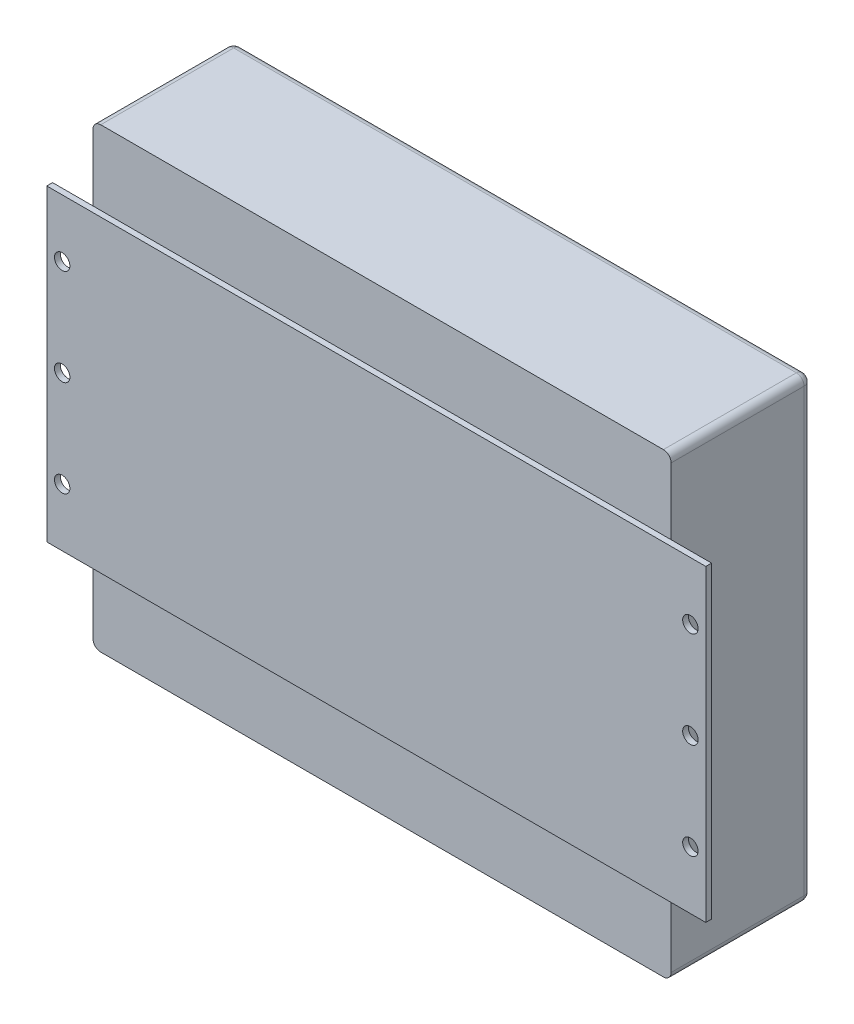
ISO-10303-21;
HEADER;
FILE_DESCRIPTION(('STEP AP214'),'2;1');
FILE_NAME('part.step','',(''),(''),'','','');
FILE_SCHEMA(('AUTOMOTIVE_DESIGN { 1 0 10303 214 1 1 1 1 }'));
ENDSEC;
DATA;
#1=APPLICATION_CONTEXT('core data for automotive mechanical design processes');
#2=APPLICATION_PROTOCOL_DEFINITION('international standard','automotive_design',2000,#1);
#3=PRODUCT_CONTEXT('',#1,'mechanical');
#4=PRODUCT('Part','Part','',(#3));
#5=PRODUCT_RELATED_PRODUCT_CATEGORY('part','',(#4));
#6=PRODUCT_DEFINITION_FORMATION('','',#4);
#7=PRODUCT_DEFINITION_CONTEXT('part definition',#1,'design');
#8=PRODUCT_DEFINITION('design','',#6,#7);
#9=PRODUCT_DEFINITION_SHAPE('','',#8);
#10=(LENGTH_UNIT() NAMED_UNIT(*) SI_UNIT(.MILLI.,.METRE.));
#11=(NAMED_UNIT(*) PLANE_ANGLE_UNIT() SI_UNIT($,.RADIAN.));
#12=(NAMED_UNIT(*) SI_UNIT($,.STERADIAN.) SOLID_ANGLE_UNIT());
#13=UNCERTAINTY_MEASURE_WITH_UNIT(LENGTH_MEASURE(1.E-05),#10,'distance_accuracy_value','');
#14=(GEOMETRIC_REPRESENTATION_CONTEXT(3) GLOBAL_UNCERTAINTY_ASSIGNED_CONTEXT((#13)) GLOBAL_UNIT_ASSIGNED_CONTEXT((#10,
#11,#12)) REPRESENTATION_CONTEXT('',''));
#15=CARTESIAN_POINT('',(0.,0.,0.));
#16=DIRECTION('',(0.,0.,1.));
#17=DIRECTION('',(1.,0.,0.));
#18=AXIS2_PLACEMENT_3D('',#15,#16,#17);
#19=CARTESIAN_POINT('',(0.,0.,0.));
#20=DIRECTION('',(0.,0.,1.));
#21=DIRECTION('',(1.,0.,0.));
#22=AXIS2_PLACEMENT_3D('',#19,#20,#21);
#23=PLANE('',#22);
#24=CARTESIAN_POINT('',(-81.5,-25.,0.));
#25=DIRECTION('',(0.,0.,1.));
#26=DIRECTION('',(1.,0.,0.));
#27=AXIS2_PLACEMENT_3D('',#24,#25,#26);
#28=CIRCLE('',#27,2.);
#29=CARTESIAN_POINT('',(-79.5,-25.,0.));
#30=VERTEX_POINT('',#29);
#31=EDGE_CURVE('E232',#30,#30,#28,.T.);
#32=ORIENTED_EDGE('',*,*,#31,.T.);
#33=EDGE_LOOP('',(#32));
#34=FACE_BOUND('',#33,.T.);
#35=CARTESIAN_POINT('',(-81.5,0.,0.));
#36=DIRECTION('',(0.,0.,1.));
#37=DIRECTION('',(1.,0.,0.));
#38=AXIS2_PLACEMENT_3D('',#35,#36,#37);
#39=CIRCLE('',#38,2.);
#40=CARTESIAN_POINT('',(-79.5,0.,0.));
#41=VERTEX_POINT('',#40);
#42=EDGE_CURVE('E225',#41,#41,#39,.T.);
#43=ORIENTED_EDGE('',*,*,#42,.T.);
#44=EDGE_LOOP('',(#43));
#45=FACE_BOUND('',#44,.T.);
#46=CARTESIAN_POINT('',(-81.5,25.,0.));
#47=DIRECTION('',(0.,0.,1.));
#48=DIRECTION('',(1.,0.,0.));
#49=AXIS2_PLACEMENT_3D('',#46,#47,#48);
#50=CIRCLE('',#49,2.);
#51=CARTESIAN_POINT('',(-79.5,25.,0.));
#52=VERTEX_POINT('',#51);
#53=EDGE_CURVE('E218',#52,#52,#50,.T.);
#54=ORIENTED_EDGE('',*,*,#53,.T.);
#55=EDGE_LOOP('',(#54));
#56=FACE_BOUND('',#55,.T.);
#57=DIRECTION('',(0.,1.,0.));
#58=VECTOR('',#57,1.);
#59=CARTESIAN_POINT('',(-75.,40.,0.));
#60=LINE('',#59,#58);
#61=CARTESIAN_POINT('',(-75.,-40.,0.));
#62=VERTEX_POINT('',#61);
#63=CARTESIAN_POINT('',(-75.,40.,0.));
#64=VERTEX_POINT('',#63);
#65=EDGE_CURVE('E170',#62,#64,#60,.T.);
#66=ORIENTED_EDGE('',*,*,#65,.F.);
#67=DIRECTION('',(1.,0.,0.));
#68=VECTOR('',#67,1.);
#69=CARTESIAN_POINT('',(-85.5,-40.,0.));
#70=LINE('',#69,#68);
#71=CARTESIAN_POINT('',(-85.5,-40.,0.));
#72=VERTEX_POINT('',#71);
#73=EDGE_CURVE('E137',#72,#62,#70,.T.);
#74=ORIENTED_EDGE('',*,*,#73,.F.);
#75=DIRECTION('',(0.,-1.,0.));
#76=VECTOR('',#75,1.);
#77=CARTESIAN_POINT('',(-85.5,40.,0.));
#78=LINE('',#77,#76);
#79=CARTESIAN_POINT('',(-85.5,40.,0.));
#80=VERTEX_POINT('',#79);
#81=EDGE_CURVE('E248',#80,#72,#78,.T.);
#82=ORIENTED_EDGE('',*,*,#81,.F.);
#83=DIRECTION('',(-1.,0.,0.));
#84=VECTOR('',#83,1.);
#85=CARTESIAN_POINT('',(85.5,40.,0.));
#86=LINE('',#85,#84);
#87=EDGE_CURVE('E251',#64,#80,#86,.T.);
#88=ORIENTED_EDGE('',*,*,#87,.F.);
#89=EDGE_LOOP('',(#66,#74,#82,#88));
#90=FACE_BOUND('',#89,.T.);
#91=ADVANCED_FACE('F17',(#34,#45,#56,#90),#23,.F.);
#92=CARTESIAN_POINT('',(81.5,0.,0.));
#93=DIRECTION('',(0.,0.,1.));
#94=DIRECTION('',(1.,0.,0.));
#95=AXIS2_PLACEMENT_3D('',#92,#93,#94);
#96=CIRCLE('',#95,2.);
#97=CARTESIAN_POINT('',(83.5,0.,0.));
#98=VERTEX_POINT('',#97);
#99=EDGE_CURVE('E211',#98,#98,#96,.T.);
#100=ORIENTED_EDGE('',*,*,#99,.T.);
#101=EDGE_LOOP('',(#100));
#102=FACE_BOUND('',#101,.T.);
#103=CARTESIAN_POINT('',(81.5,-25.,0.));
#104=DIRECTION('',(0.,0.,1.));
#105=DIRECTION('',(1.,0.,0.));
#106=AXIS2_PLACEMENT_3D('',#103,#104,#105);
#107=CIRCLE('',#106,2.);
#108=CARTESIAN_POINT('',(83.5,-25.,0.));
#109=VERTEX_POINT('',#108);
#110=EDGE_CURVE('E204',#109,#109,#107,.T.);
#111=ORIENTED_EDGE('',*,*,#110,.T.);
#112=EDGE_LOOP('',(#111));
#113=FACE_BOUND('',#112,.T.);
#114=CARTESIAN_POINT('',(81.5,25.,0.));
#115=DIRECTION('',(0.,0.,1.));
#116=DIRECTION('',(-1.,0.,0.));
#117=AXIS2_PLACEMENT_3D('',#114,#115,#116);
#118=CIRCLE('',#117,2.);
#119=CARTESIAN_POINT('',(79.5,25.,0.));
#120=VERTEX_POINT('',#119);
#121=EDGE_CURVE('E195',#120,#120,#118,.T.);
#122=ORIENTED_EDGE('',*,*,#121,.T.);
#123=EDGE_LOOP('',(#122));
#124=FACE_BOUND('',#123,.T.);
#125=DIRECTION('',(0.,-1.,0.));
#126=VECTOR('',#125,1.);
#127=CARTESIAN_POINT('',(75.,-40.,0.));
#128=LINE('',#127,#126);
#129=CARTESIAN_POINT('',(75.,40.,0.));
#130=VERTEX_POINT('',#129);
#131=CARTESIAN_POINT('',(75.,-40.,0.));
#132=VERTEX_POINT('',#131);
#133=EDGE_CURVE('E148',#130,#132,#128,.T.);
#134=ORIENTED_EDGE('',*,*,#133,.F.);
#135=CARTESIAN_POINT('',(85.5,40.,0.));
#136=VERTEX_POINT('',#135);
#137=EDGE_CURVE('E252',#136,#130,#86,.T.);
#138=ORIENTED_EDGE('',*,*,#137,.F.);
#139=DIRECTION('',(0.,1.,0.));
#140=VECTOR('',#139,1.);
#141=CARTESIAN_POINT('',(85.5,-40.,0.));
#142=LINE('',#141,#140);
#143=CARTESIAN_POINT('',(85.5,-40.,0.));
#144=VERTEX_POINT('',#143);
#145=EDGE_CURVE('E150',#144,#136,#142,.T.);
#146=ORIENTED_EDGE('',*,*,#145,.F.);
#147=EDGE_CURVE('E133',#132,#144,#70,.T.);
#148=ORIENTED_EDGE('',*,*,#147,.F.);
#149=EDGE_LOOP('',(#134,#138,#146,#148));
#150=FACE_BOUND('',#149,.T.);
#151=ADVANCED_FACE('F145',(#102,#113,#124,#150),#23,.F.);
#152=CARTESIAN_POINT('',(-85.5,-40.,1.5));
#153=DIRECTION('',(0.,1.,0.));
#154=DIRECTION('',(0.,0.,1.));
#155=AXIS2_PLACEMENT_3D('',#152,#153,#154);
#156=PLANE('',#155);
#157=ORIENTED_EDGE('',*,*,#73,.T.);
#158=EDGE_CURVE('E129',#62,#132,#70,.T.);
#159=ORIENTED_EDGE('',*,*,#158,.T.);
#160=ORIENTED_EDGE('',*,*,#147,.T.);
#161=DIRECTION('',(0.,0.,-1.));
#162=VECTOR('',#161,1.);
#163=CARTESIAN_POINT('',(85.5,-40.,1.5));
#164=LINE('',#163,#162);
#165=CARTESIAN_POINT('',(85.5,-40.,1.5));
#166=VERTEX_POINT('',#165);
#167=EDGE_CURVE('E171',#166,#144,#164,.T.);
#168=ORIENTED_EDGE('',*,*,#167,.F.);
#169=DIRECTION('',(1.,0.,0.));
#170=VECTOR('',#169,1.);
#171=CARTESIAN_POINT('',(-85.5,-40.,1.5));
#172=LINE('',#171,#170);
#173=CARTESIAN_POINT('',(-85.5,-40.,1.5));
#174=VERTEX_POINT('',#173);
#175=EDGE_CURVE('E241',#174,#166,#172,.T.);
#176=ORIENTED_EDGE('',*,*,#175,.F.);
#177=DIRECTION('',(0.,0.,-1.));
#178=VECTOR('',#177,1.);
#179=CARTESIAN_POINT('',(-85.5,-40.,1.5));
#180=LINE('',#179,#178);
#181=EDGE_CURVE('E245',#174,#72,#180,.T.);
#182=ORIENTED_EDGE('',*,*,#181,.T.);
#183=EDGE_LOOP('',(#157,#159,#160,#168,#176,#182));
#184=FACE_BOUND('',#183,.T.);
#185=ADVANCED_FACE('F131',(#184),#156,.F.);
#186=CARTESIAN_POINT('',(85.5,-40.,1.5));
#187=DIRECTION('',(-1.,0.,0.));
#188=DIRECTION('',(0.,0.,1.));
#189=AXIS2_PLACEMENT_3D('',#186,#187,#188);
#190=PLANE('',#189);
#191=ORIENTED_EDGE('',*,*,#145,.T.);
#192=DIRECTION('',(0.,0.,-1.));
#193=VECTOR('',#192,1.);
#194=CARTESIAN_POINT('',(85.5,40.,1.5));
#195=LINE('',#194,#193);
#196=CARTESIAN_POINT('',(85.5,40.,1.5));
#197=VERTEX_POINT('',#196);
#198=EDGE_CURVE('E181',#197,#136,#195,.T.);
#199=ORIENTED_EDGE('',*,*,#198,.F.);
#200=DIRECTION('',(0.,1.,0.));
#201=VECTOR('',#200,1.);
#202=CARTESIAN_POINT('',(85.5,-40.,1.5));
#203=LINE('',#202,#201);
#204=EDGE_CURVE('E238',#166,#197,#203,.T.);
#205=ORIENTED_EDGE('',*,*,#204,.F.);
#206=ORIENTED_EDGE('',*,*,#167,.T.);
#207=EDGE_LOOP('',(#191,#199,#205,#206));
#208=FACE_BOUND('',#207,.T.);
#209=ADVANCED_FACE('F415',(#208),#190,.F.);
#210=CARTESIAN_POINT('',(85.5,40.,1.5));
#211=DIRECTION('',(0.,-1.,0.));
#212=DIRECTION('',(0.,0.,-1.));
#213=AXIS2_PLACEMENT_3D('',#210,#211,#212);
#214=PLANE('',#213);
#215=ORIENTED_EDGE('',*,*,#137,.T.);
#216=EDGE_CURVE('E255',#130,#64,#86,.T.);
#217=ORIENTED_EDGE('',*,*,#216,.T.);
#218=ORIENTED_EDGE('',*,*,#87,.T.);
#219=DIRECTION('',(0.,0.,-1.));
#220=VECTOR('',#219,1.);
#221=CARTESIAN_POINT('',(-85.5,40.,1.5));
#222=LINE('',#221,#220);
#223=CARTESIAN_POINT('',(-85.5,40.,1.5));
#224=VERTEX_POINT('',#223);
#225=EDGE_CURVE('E260',#224,#80,#222,.T.);
#226=ORIENTED_EDGE('',*,*,#225,.F.);
#227=DIRECTION('',(-1.,0.,0.));
#228=VECTOR('',#227,1.);
#229=CARTESIAN_POINT('',(85.5,40.,1.5));
#230=LINE('',#229,#228);
#231=EDGE_CURVE('E240',#197,#224,#230,.T.);
#232=ORIENTED_EDGE('',*,*,#231,.F.);
#233=ORIENTED_EDGE('',*,*,#198,.T.);
#234=EDGE_LOOP('',(#215,#217,#218,#226,#232,#233));
#235=FACE_BOUND('',#234,.T.);
#236=ADVANCED_FACE('F411',(#235),#214,.F.);
#237=CARTESIAN_POINT('',(-85.5,40.,1.5));
#238=DIRECTION('',(1.,0.,0.));
#239=DIRECTION('',(0.,0.,-1.));
#240=AXIS2_PLACEMENT_3D('',#237,#238,#239);
#241=PLANE('',#240);
#242=ORIENTED_EDGE('',*,*,#81,.T.);
#243=ORIENTED_EDGE('',*,*,#181,.F.);
#244=DIRECTION('',(0.,-1.,0.));
#245=VECTOR('',#244,1.);
#246=CARTESIAN_POINT('',(-85.5,40.,1.5));
#247=LINE('',#246,#245);
#248=EDGE_CURVE('E243',#224,#174,#247,.T.);
#249=ORIENTED_EDGE('',*,*,#248,.F.);
#250=ORIENTED_EDGE('',*,*,#225,.T.);
#251=EDGE_LOOP('',(#242,#243,#249,#250));
#252=FACE_BOUND('',#251,.T.);
#253=ADVANCED_FACE('F408',(#252),#241,.F.);
#254=CARTESIAN_POINT('',(0.,0.,1.5));
#255=DIRECTION('',(0.,0.,1.));
#256=DIRECTION('',(1.,0.,0.));
#257=AXIS2_PLACEMENT_3D('',#254,#255,#256);
#258=PLANE('',#257);
#259=CARTESIAN_POINT('',(81.5,25.,1.5));
#260=DIRECTION('',(0.,0.,1.));
#261=DIRECTION('',(1.,0.,0.));
#262=AXIS2_PLACEMENT_3D('',#259,#260,#261);
#263=CIRCLE('',#262,2.);
#264=CARTESIAN_POINT('',(83.5,25.,1.5));
#265=VERTEX_POINT('',#264);
#266=EDGE_CURVE('E201',#265,#265,#263,.F.);
#267=ORIENTED_EDGE('',*,*,#266,.T.);
#268=EDGE_LOOP('',(#267));
#269=FACE_BOUND('',#268,.T.);
#270=CARTESIAN_POINT('',(81.5,-25.,1.5));
#271=DIRECTION('',(0.,0.,1.));
#272=DIRECTION('',(1.,0.,0.));
#273=AXIS2_PLACEMENT_3D('',#270,#271,#272);
#274=CIRCLE('',#273,2.);
#275=CARTESIAN_POINT('',(83.5,-25.,1.5));
#276=VERTEX_POINT('',#275);
#277=EDGE_CURVE('E208',#276,#276,#274,.F.);
#278=ORIENTED_EDGE('',*,*,#277,.T.);
#279=EDGE_LOOP('',(#278));
#280=FACE_BOUND('',#279,.T.);
#281=CARTESIAN_POINT('',(81.5,0.,1.5));
#282=DIRECTION('',(0.,0.,1.));
#283=DIRECTION('',(1.,0.,0.));
#284=AXIS2_PLACEMENT_3D('',#281,#282,#283);
#285=CIRCLE('',#284,2.);
#286=CARTESIAN_POINT('',(83.5,0.,1.5));
#287=VERTEX_POINT('',#286);
#288=EDGE_CURVE('E215',#287,#287,#285,.F.);
#289=ORIENTED_EDGE('',*,*,#288,.T.);
#290=EDGE_LOOP('',(#289));
#291=FACE_BOUND('',#290,.T.);
#292=CARTESIAN_POINT('',(-81.5,25.,1.5));
#293=DIRECTION('',(0.,0.,1.));
#294=DIRECTION('',(1.,0.,0.));
#295=AXIS2_PLACEMENT_3D('',#292,#293,#294);
#296=CIRCLE('',#295,2.);
#297=CARTESIAN_POINT('',(-79.5,25.,1.5));
#298=VERTEX_POINT('',#297);
#299=EDGE_CURVE('E222',#298,#298,#296,.F.);
#300=ORIENTED_EDGE('',*,*,#299,.T.);
#301=EDGE_LOOP('',(#300));
#302=FACE_BOUND('',#301,.T.);
#303=CARTESIAN_POINT('',(-81.5,0.,1.5));
#304=DIRECTION('',(0.,0.,1.));
#305=DIRECTION('',(1.,0.,0.));
#306=AXIS2_PLACEMENT_3D('',#303,#304,#305);
#307=CIRCLE('',#306,2.);
#308=CARTESIAN_POINT('',(-79.5,0.,1.5));
#309=VERTEX_POINT('',#308);
#310=EDGE_CURVE('E229',#309,#309,#307,.F.);
#311=ORIENTED_EDGE('',*,*,#310,.T.);
#312=EDGE_LOOP('',(#311));
#313=FACE_BOUND('',#312,.T.);
#314=CARTESIAN_POINT('',(-81.5,-25.,1.5));
#315=DIRECTION('',(0.,0.,1.));
#316=DIRECTION('',(1.,0.,0.));
#317=AXIS2_PLACEMENT_3D('',#314,#315,#316);
#318=CIRCLE('',#317,2.);
#319=CARTESIAN_POINT('',(-79.5,-25.,1.5));
#320=VERTEX_POINT('',#319);
#321=EDGE_CURVE('E153',#320,#320,#318,.F.);
#322=ORIENTED_EDGE('',*,*,#321,.T.);
#323=EDGE_LOOP('',(#322));
#324=FACE_BOUND('',#323,.T.);
#325=ORIENTED_EDGE('',*,*,#175,.T.);
#326=ORIENTED_EDGE('',*,*,#204,.T.);
#327=ORIENTED_EDGE('',*,*,#231,.T.);
#328=ORIENTED_EDGE('',*,*,#248,.T.);
#329=EDGE_LOOP('',(#325,#326,#327,#328));
#330=FACE_BOUND('',#329,.T.);
#331=ADVANCED_FACE('F406',(#269,#280,#291,#302,#313,#324,#330),#258,.T.);
#332=CARTESIAN_POINT('',(-81.5,-25.,26.462180804442));
#333=DIRECTION('',(0.,0.,-1.));
#334=DIRECTION('',(-1.,0.,0.));
#335=AXIS2_PLACEMENT_3D('',#332,#333,#334);
#336=CYLINDRICAL_SURFACE('',#335,2.);
#337=ORIENTED_EDGE('',*,*,#321,.F.);
#338=EDGE_LOOP('',(#337));
#339=FACE_BOUND('',#338,.T.);
#340=ORIENTED_EDGE('',*,*,#31,.F.);
#341=EDGE_LOOP('',(#340));
#342=FACE_BOUND('',#341,.T.);
#343=ADVANCED_FACE('F679',(#339,#342),#336,.F.);
#344=CARTESIAN_POINT('',(-81.5,0.,26.462180804442));
#345=DIRECTION('',(0.,0.,-1.));
#346=DIRECTION('',(-1.,0.,0.));
#347=AXIS2_PLACEMENT_3D('',#344,#345,#346);
#348=CYLINDRICAL_SURFACE('',#347,2.);
#349=ORIENTED_EDGE('',*,*,#310,.F.);
#350=EDGE_LOOP('',(#349));
#351=FACE_BOUND('',#350,.T.);
#352=ORIENTED_EDGE('',*,*,#42,.F.);
#353=EDGE_LOOP('',(#352));
#354=FACE_BOUND('',#353,.T.);
#355=ADVANCED_FACE('F667',(#351,#354),#348,.F.);
#356=CARTESIAN_POINT('',(-81.5,25.,26.462180804442));
#357=DIRECTION('',(0.,0.,-1.));
#358=DIRECTION('',(-1.,0.,0.));
#359=AXIS2_PLACEMENT_3D('',#356,#357,#358);
#360=CYLINDRICAL_SURFACE('',#359,2.);
#361=ORIENTED_EDGE('',*,*,#299,.F.);
#362=EDGE_LOOP('',(#361));
#363=FACE_BOUND('',#362,.T.);
#364=ORIENTED_EDGE('',*,*,#53,.F.);
#365=EDGE_LOOP('',(#364));
#366=FACE_BOUND('',#365,.T.);
#367=ADVANCED_FACE('F655',(#363,#366),#360,.F.);
#368=CARTESIAN_POINT('',(81.5,0.,26.462180804442));
#369=DIRECTION('',(0.,0.,-1.));
#370=DIRECTION('',(-1.,0.,0.));
#371=AXIS2_PLACEMENT_3D('',#368,#369,#370);
#372=CYLINDRICAL_SURFACE('',#371,2.);
#373=ORIENTED_EDGE('',*,*,#288,.F.);
#374=EDGE_LOOP('',(#373));
#375=FACE_BOUND('',#374,.T.);
#376=ORIENTED_EDGE('',*,*,#99,.F.);
#377=EDGE_LOOP('',(#376));
#378=FACE_BOUND('',#377,.T.);
#379=ADVANCED_FACE('F643',(#375,#378),#372,.F.);
#380=CARTESIAN_POINT('',(81.5,-25.,26.462180804442));
#381=DIRECTION('',(0.,0.,-1.));
#382=DIRECTION('',(-1.,0.,0.));
#383=AXIS2_PLACEMENT_3D('',#380,#381,#382);
#384=CYLINDRICAL_SURFACE('',#383,2.);
#385=ORIENTED_EDGE('',*,*,#277,.F.);
#386=EDGE_LOOP('',(#385));
#387=FACE_BOUND('',#386,.T.);
#388=ORIENTED_EDGE('',*,*,#110,.F.);
#389=EDGE_LOOP('',(#388));
#390=FACE_BOUND('',#389,.T.);
#391=ADVANCED_FACE('F630',(#387,#390),#384,.F.);
#392=CARTESIAN_POINT('',(81.5,25.,26.462180804442));
#393=DIRECTION('',(0.,0.,-1.));
#394=DIRECTION('',(-1.,0.,0.));
#395=AXIS2_PLACEMENT_3D('',#392,#393,#394);
#396=CYLINDRICAL_SURFACE('',#395,2.);
#397=ORIENTED_EDGE('',*,*,#266,.F.);
#398=EDGE_LOOP('',(#397));
#399=FACE_BOUND('',#398,.T.);
#400=ORIENTED_EDGE('',*,*,#121,.F.);
#401=EDGE_LOOP('',(#400));
#402=FACE_BOUND('',#401,.T.);
#403=ADVANCED_FACE('F619',(#399,#402),#396,.F.);
#404=CARTESIAN_POINT('',(0.,0.,0.));
#405=DIRECTION('',(0.,0.,-1.));
#406=DIRECTION('',(-1.,0.,0.));
#407=AXIS2_PLACEMENT_3D('',#404,#405,#406);
#408=PLANE('',#407);
#409=DIRECTION('',(-1.,0.,0.));
#410=VECTOR('',#409,1.);
#411=CARTESIAN_POINT('',(75.,-59.25,0.));
#412=LINE('',#411,#410);
#413=CARTESIAN_POINT('',(73.,-59.25,0.));
#414=VERTEX_POINT('',#413);
#415=CARTESIAN_POINT('',(-73.,-59.25,0.));
#416=VERTEX_POINT('',#415);
#417=EDGE_CURVE('E185',#414,#416,#412,.T.);
#418=ORIENTED_EDGE('',*,*,#417,.F.);
#419=CARTESIAN_POINT('',(73.,-57.25,0.));
#420=DIRECTION('',(0.,0.,-1.));
#421=DIRECTION('',(-1.,0.,0.));
#422=AXIS2_PLACEMENT_3D('',#419,#420,#421);
#423=CIRCLE('',#422,2.);
#424=CARTESIAN_POINT('',(75.,-57.25,0.));
#425=VERTEX_POINT('',#424);
#426=EDGE_CURVE('E159',#414,#425,#423,.F.);
#427=ORIENTED_EDGE('',*,*,#426,.T.);
#428=EDGE_CURVE('E155',#132,#425,#128,.T.);
#429=ORIENTED_EDGE('',*,*,#428,.F.);
#430=ORIENTED_EDGE('',*,*,#158,.F.);
#431=CARTESIAN_POINT('',(-75.,-57.25,0.));
#432=VERTEX_POINT('',#431);
#433=EDGE_CURVE('E179',#432,#62,#60,.T.);
#434=ORIENTED_EDGE('',*,*,#433,.F.);
#435=CARTESIAN_POINT('',(-73.,-57.25,0.));
#436=DIRECTION('',(0.,0.,-1.));
#437=DIRECTION('',(-1.,0.,0.));
#438=AXIS2_PLACEMENT_3D('',#435,#436,#437);
#439=CIRCLE('',#438,2.);
#440=EDGE_CURVE('E286',#432,#416,#439,.F.);
#441=ORIENTED_EDGE('',*,*,#440,.T.);
#442=EDGE_LOOP('',(#418,#427,#429,#430,#434,#441));
#443=FACE_BOUND('',#442,.T.);
#444=ADVANCED_FACE('F157',(#443),#408,.F.);
#445=CARTESIAN_POINT('',(-75.,59.25,-36.5));
#446=DIRECTION('',(0.,-1.,0.));
#447=DIRECTION('',(0.,0.,-1.));
#448=AXIS2_PLACEMENT_3D('',#445,#446,#447);
#449=PLANE('',#448);
#450=DIRECTION('',(1.,0.,0.));
#451=VECTOR('',#450,1.);
#452=CARTESIAN_POINT('',(-75.,59.25,0.));
#453=LINE('',#452,#451);
#454=CARTESIAN_POINT('',(-73.,59.25,0.));
#455=VERTEX_POINT('',#454);
#456=CARTESIAN_POINT('',(73.,59.25,0.));
#457=VERTEX_POINT('',#456);
#458=EDGE_CURVE('E164',#455,#457,#453,.T.);
#459=ORIENTED_EDGE('',*,*,#458,.T.);
#460=DIRECTION('',(0.,0.,1.));
#461=VECTOR('',#460,1.);
#462=CARTESIAN_POINT('',(73.,59.25,-36.5));
#463=LINE('',#462,#461);
#464=CARTESIAN_POINT('',(73.,59.25,-34.5));
#465=VERTEX_POINT('',#464);
#466=EDGE_CURVE('E278',#457,#465,#463,.F.);
#467=ORIENTED_EDGE('',*,*,#466,.T.);
#468=DIRECTION('',(1.,0.,0.));
#469=VECTOR('',#468,1.);
#470=CARTESIAN_POINT('',(-75.,59.25,-34.5));
#471=LINE('',#470,#469);
#472=CARTESIAN_POINT('',(-73.,59.25,-34.5));
#473=VERTEX_POINT('',#472);
#474=EDGE_CURVE('E276',#465,#473,#471,.F.);
#475=ORIENTED_EDGE('',*,*,#474,.T.);
#476=DIRECTION('',(0.,0.,1.));
#477=VECTOR('',#476,1.);
#478=CARTESIAN_POINT('',(-73.,59.25,-36.5));
#479=LINE('',#478,#477);
#480=EDGE_CURVE('E274',#473,#455,#479,.T.);
#481=ORIENTED_EDGE('',*,*,#480,.T.);
#482=EDGE_LOOP('',(#459,#467,#475,#481));
#483=FACE_BOUND('',#482,.T.);
#484=ADVANCED_FACE('F368',(#483),#449,.F.);
#485=CARTESIAN_POINT('',(75.,-40.,-36.5));
#486=DIRECTION('',(-1.,0.,0.));
#487=DIRECTION('',(0.,0.,1.));
#488=AXIS2_PLACEMENT_3D('',#485,#486,#487);
#489=PLANE('',#488);
#490=DIRECTION('',(0.,-1.,0.));
#491=VECTOR('',#490,1.);
#492=CARTESIAN_POINT('',(75.,59.25,-34.5));
#493=LINE('',#492,#491);
#494=CARTESIAN_POINT('',(75.,-57.25,-34.5));
#495=VERTEX_POINT('',#494);
#496=CARTESIAN_POINT('',(75.,57.25,-34.5));
#497=VERTEX_POINT('',#496);
#498=EDGE_CURVE('E177',#495,#497,#493,.F.);
#499=ORIENTED_EDGE('',*,*,#498,.T.);
#500=DIRECTION('',(0.,0.,1.));
#501=VECTOR('',#500,1.);
#502=CARTESIAN_POINT('',(75.,57.25,-36.5));
#503=LINE('',#502,#501);
#504=CARTESIAN_POINT('',(75.,57.25,0.));
#505=VERTEX_POINT('',#504);
#506=EDGE_CURVE('E268',#497,#505,#503,.T.);
#507=ORIENTED_EDGE('',*,*,#506,.T.);
#508=EDGE_CURVE('E163',#505,#130,#128,.T.);
#509=ORIENTED_EDGE('',*,*,#508,.T.);
#510=ORIENTED_EDGE('',*,*,#133,.T.);
#511=ORIENTED_EDGE('',*,*,#428,.T.);
#512=DIRECTION('',(0.,0.,1.));
#513=VECTOR('',#512,1.);
#514=CARTESIAN_POINT('',(75.,-57.25,-36.5));
#515=LINE('',#514,#513);
#516=EDGE_CURVE('E266',#425,#495,#515,.F.);
#517=ORIENTED_EDGE('',*,*,#516,.T.);
#518=EDGE_LOOP('',(#499,#507,#509,#510,#511,#517));
#519=FACE_BOUND('',#518,.T.);
#520=ADVANCED_FACE('F166',(#519),#489,.F.);
#521=CARTESIAN_POINT('',(75.,-59.25,-36.5));
#522=DIRECTION('',(0.,1.,0.));
#523=DIRECTION('',(0.,0.,1.));
#524=AXIS2_PLACEMENT_3D('',#521,#522,#523);
#525=PLANE('',#524);
#526=DIRECTION('',(-1.,0.,0.));
#527=VECTOR('',#526,1.);
#528=CARTESIAN_POINT('',(75.,-59.25,-34.5));
#529=LINE('',#528,#527);
#530=CARTESIAN_POINT('',(-73.,-59.25,-34.5));
#531=VERTEX_POINT('',#530);
#532=CARTESIAN_POINT('',(73.,-59.25,-34.5));
#533=VERTEX_POINT('',#532);
#534=EDGE_CURVE('E280',#531,#533,#529,.F.);
#535=ORIENTED_EDGE('',*,*,#534,.T.);
#536=DIRECTION('',(0.,0.,1.));
#537=VECTOR('',#536,1.);
#538=CARTESIAN_POINT('',(73.,-59.25,-36.5));
#539=LINE('',#538,#537);
#540=EDGE_CURVE('E284',#533,#414,#539,.T.);
#541=ORIENTED_EDGE('',*,*,#540,.T.);
#542=ORIENTED_EDGE('',*,*,#417,.T.);
#543=DIRECTION('',(0.,0.,1.));
#544=VECTOR('',#543,1.);
#545=CARTESIAN_POINT('',(-73.,-59.25,-36.5));
#546=LINE('',#545,#544);
#547=EDGE_CURVE('E282',#416,#531,#546,.F.);
#548=ORIENTED_EDGE('',*,*,#547,.T.);
#549=EDGE_LOOP('',(#535,#541,#542,#548));
#550=FACE_BOUND('',#549,.T.);
#551=ADVANCED_FACE('F578',(#550),#525,.F.);
#552=CARTESIAN_POINT('',(-75.,40.,-36.5));
#553=DIRECTION('',(1.,0.,0.));
#554=DIRECTION('',(0.,0.,-1.));
#555=AXIS2_PLACEMENT_3D('',#552,#553,#554);
#556=PLANE('',#555);
#557=CARTESIAN_POINT('',(-75.,57.25,0.));
#558=VERTEX_POINT('',#557);
#559=EDGE_CURVE('E180',#64,#558,#60,.T.);
#560=ORIENTED_EDGE('',*,*,#559,.T.);
#561=DIRECTION('',(0.,0.,1.));
#562=VECTOR('',#561,1.);
#563=CARTESIAN_POINT('',(-75.,57.25,-36.5));
#564=LINE('',#563,#562);
#565=CARTESIAN_POINT('',(-75.,57.25,-34.5));
#566=VERTEX_POINT('',#565);
#567=EDGE_CURVE('E11',#558,#566,#564,.F.);
#568=ORIENTED_EDGE('',*,*,#567,.T.);
#569=DIRECTION('',(0.,1.,0.));
#570=VECTOR('',#569,1.);
#571=CARTESIAN_POINT('',(-75.,-59.25,-34.5));
#572=LINE('',#571,#570);
#573=CARTESIAN_POINT('',(-75.,-57.25,-34.5));
#574=VERTEX_POINT('',#573);
#575=EDGE_CURVE('E33',#566,#574,#572,.F.);
#576=ORIENTED_EDGE('',*,*,#575,.T.);
#577=DIRECTION('',(0.,0.,1.));
#578=VECTOR('',#577,1.);
#579=CARTESIAN_POINT('',(-75.,-57.25,-36.5));
#580=LINE('',#579,#578);
#581=EDGE_CURVE('E26',#574,#432,#580,.T.);
#582=ORIENTED_EDGE('',*,*,#581,.T.);
#583=ORIENTED_EDGE('',*,*,#433,.T.);
#584=ORIENTED_EDGE('',*,*,#65,.T.);
#585=EDGE_LOOP('',(#560,#568,#576,#582,#583,#584));
#586=FACE_BOUND('',#585,.T.);
#587=ADVANCED_FACE('F341',(#586),#556,.F.);
#588=CARTESIAN_POINT('',(0.,0.,-36.5));
#589=DIRECTION('',(0.,0.,-1.));
#590=DIRECTION('',(-1.,0.,0.));
#591=AXIS2_PLACEMENT_3D('',#588,#589,#590);
#592=PLANE('',#591);
#593=DIRECTION('',(1.,0.,0.));
#594=VECTOR('',#593,1.);
#595=CARTESIAN_POINT('',(75.,57.25,-36.5));
#596=LINE('',#595,#594);
#597=CARTESIAN_POINT('',(-73.,57.25,-36.5));
#598=VERTEX_POINT('',#597);
#599=CARTESIAN_POINT('',(73.,57.25,-36.5));
#600=VERTEX_POINT('',#599);
#601=EDGE_CURVE('E293',#598,#600,#596,.T.);
#602=ORIENTED_EDGE('',*,*,#601,.T.);
#603=DIRECTION('',(0.,-1.,0.));
#604=VECTOR('',#603,1.);
#605=CARTESIAN_POINT('',(73.,-59.25,-36.5));
#606=LINE('',#605,#604);
#607=CARTESIAN_POINT('',(73.,-57.25,-36.5));
#608=VERTEX_POINT('',#607);
#609=EDGE_CURVE('E295',#600,#608,#606,.T.);
#610=ORIENTED_EDGE('',*,*,#609,.T.);
#611=DIRECTION('',(-1.,0.,0.));
#612=VECTOR('',#611,1.);
#613=CARTESIAN_POINT('',(-75.,-57.25,-36.5));
#614=LINE('',#613,#612);
#615=CARTESIAN_POINT('',(-73.,-57.25,-36.5));
#616=VERTEX_POINT('',#615);
#617=EDGE_CURVE('E291',#608,#616,#614,.T.);
#618=ORIENTED_EDGE('',*,*,#617,.T.);
#619=DIRECTION('',(0.,1.,0.));
#620=VECTOR('',#619,1.);
#621=CARTESIAN_POINT('',(-73.,59.25,-36.5));
#622=LINE('',#621,#620);
#623=EDGE_CURVE('E289',#616,#598,#622,.T.);
#624=ORIENTED_EDGE('',*,*,#623,.T.);
#625=EDGE_LOOP('',(#602,#610,#618,#624));
#626=FACE_BOUND('',#625,.T.);
#627=ADVANCED_FACE('F382',(#626),#592,.T.);
#628=ORIENTED_EDGE('',*,*,#508,.F.);
#629=CARTESIAN_POINT('',(73.,57.25,0.));
#630=DIRECTION('',(0.,0.,-1.));
#631=DIRECTION('',(-1.,0.,0.));
#632=AXIS2_PLACEMENT_3D('',#629,#630,#631);
#633=CIRCLE('',#632,2.);
#634=EDGE_CURVE('E272',#505,#457,#633,.F.);
#635=ORIENTED_EDGE('',*,*,#634,.T.);
#636=ORIENTED_EDGE('',*,*,#458,.F.);
#637=CARTESIAN_POINT('',(-73.,57.25,0.));
#638=DIRECTION('',(0.,0.,-1.));
#639=DIRECTION('',(-1.,0.,0.));
#640=AXIS2_PLACEMENT_3D('',#637,#638,#639);
#641=CIRCLE('',#640,2.);
#642=EDGE_CURVE('E270',#455,#558,#641,.F.);
#643=ORIENTED_EDGE('',*,*,#642,.T.);
#644=ORIENTED_EDGE('',*,*,#559,.F.);
#645=ORIENTED_EDGE('',*,*,#216,.F.);
#646=EDGE_LOOP('',(#628,#635,#636,#643,#644,#645));
#647=FACE_BOUND('',#646,.T.);
#648=ADVANCED_FACE('F364',(#647),#408,.F.);
#649=CARTESIAN_POINT('',(-73.,-57.25,-36.5));
#650=DIRECTION('',(0.,0.,1.));
#651=DIRECTION('',(1.,0.,0.));
#652=AXIS2_PLACEMENT_3D('',#649,#650,#651);
#653=CYLINDRICAL_SURFACE('',#652,2.);
#654=CARTESIAN_POINT('',(-73.,-57.25,-34.5));
#655=DIRECTION('',(0.,0.,-1.));
#656=DIRECTION('',(-1.,0.,0.));
#657=AXIS2_PLACEMENT_3D('',#654,#655,#656);
#658=CIRCLE('',#657,2.);
#659=EDGE_CURVE('E21',#531,#574,#658,.T.);
#660=ORIENTED_EDGE('',*,*,#659,.F.);
#661=ORIENTED_EDGE('',*,*,#547,.F.);
#662=ORIENTED_EDGE('',*,*,#440,.F.);
#663=ORIENTED_EDGE('',*,*,#581,.F.);
#664=EDGE_LOOP('',(#660,#661,#662,#663));
#665=FACE_BOUND('',#664,.T.);
#666=ADVANCED_FACE('F19',(#665),#653,.T.);
#667=CARTESIAN_POINT('',(-73.,-57.25,-34.5));
#668=DIRECTION('',(0.,0.,1.));
#669=DIRECTION('',(1.,0.,0.));
#670=AXIS2_PLACEMENT_3D('',#667,#668,#669);
#671=SPHERICAL_SURFACE('',#670,2.);
#672=CARTESIAN_POINT('',(-73.,-57.25,-34.5));
#673=DIRECTION('',(-1.,0.,0.));
#674=DIRECTION('',(0.,0.,1.));
#675=AXIS2_PLACEMENT_3D('',#672,#673,#674);
#676=CIRCLE('',#675,2.);
#677=EDGE_CURVE('E326',#531,#616,#676,.F.);
#678=ORIENTED_EDGE('',*,*,#677,.F.);
#679=ORIENTED_EDGE('',*,*,#659,.T.);
#680=CARTESIAN_POINT('',(-73.,-57.25,-34.5));
#681=DIRECTION('',(0.,-1.,0.));
#682=DIRECTION('',(0.,0.,-1.));
#683=AXIS2_PLACEMENT_3D('',#680,#681,#682);
#684=CIRCLE('',#683,2.);
#685=EDGE_CURVE('E328',#616,#574,#684,.F.);
#686=ORIENTED_EDGE('',*,*,#685,.F.);
#687=EDGE_LOOP('',(#678,#679,#686));
#688=FACE_BOUND('',#687,.T.);
#689=ADVANCED_FACE('F337',(#688),#671,.T.);
#690=CARTESIAN_POINT('',(-73.,57.25,-36.5));
#691=DIRECTION('',(0.,0.,1.));
#692=DIRECTION('',(1.,0.,0.));
#693=AXIS2_PLACEMENT_3D('',#690,#691,#692);
#694=CYLINDRICAL_SURFACE('',#693,2.);
#695=ORIENTED_EDGE('',*,*,#642,.F.);
#696=ORIENTED_EDGE('',*,*,#480,.F.);
#697=CARTESIAN_POINT('',(-73.,57.25,-34.5));
#698=DIRECTION('',(0.,0.,-1.));
#699=DIRECTION('',(-1.,0.,0.));
#700=AXIS2_PLACEMENT_3D('',#697,#698,#699);
#701=CIRCLE('',#700,2.);
#702=EDGE_CURVE('E323',#566,#473,#701,.T.);
#703=ORIENTED_EDGE('',*,*,#702,.F.);
#704=ORIENTED_EDGE('',*,*,#567,.F.);
#705=EDGE_LOOP('',(#695,#696,#703,#704));
#706=FACE_BOUND('',#705,.T.);
#707=ADVANCED_FACE('F373',(#706),#694,.T.);
#708=CARTESIAN_POINT('',(-73.,0.,-34.5));
#709=DIRECTION('',(0.,-1.,0.));
#710=DIRECTION('',(0.,0.,-1.));
#711=AXIS2_PLACEMENT_3D('',#708,#709,#710);
#712=CYLINDRICAL_SURFACE('',#711,2.);
#713=ORIENTED_EDGE('',*,*,#685,.T.);
#714=ORIENTED_EDGE('',*,*,#575,.F.);
#715=CARTESIAN_POINT('',(-73.,57.25,-34.5));
#716=DIRECTION('',(0.,1.,0.));
#717=DIRECTION('',(0.,0.,1.));
#718=AXIS2_PLACEMENT_3D('',#715,#716,#717);
#719=CIRCLE('',#718,2.);
#720=EDGE_CURVE('E320',#598,#566,#719,.T.);
#721=ORIENTED_EDGE('',*,*,#720,.F.);
#722=ORIENTED_EDGE('',*,*,#623,.F.);
#723=EDGE_LOOP('',(#713,#714,#721,#722));
#724=FACE_BOUND('',#723,.T.);
#725=ADVANCED_FACE('F384',(#724),#712,.T.);
#726=CARTESIAN_POINT('',(0.,-57.25,-34.5));
#727=DIRECTION('',(1.,0.,0.));
#728=DIRECTION('',(0.,0.,-1.));
#729=AXIS2_PLACEMENT_3D('',#726,#727,#728);
#730=CYLINDRICAL_SURFACE('',#729,2.);
#731=ORIENTED_EDGE('',*,*,#677,.T.);
#732=ORIENTED_EDGE('',*,*,#617,.F.);
#733=CARTESIAN_POINT('',(73.,-57.25,-34.5));
#734=DIRECTION('',(1.,0.,0.));
#735=DIRECTION('',(0.,0.,-1.));
#736=AXIS2_PLACEMENT_3D('',#733,#734,#735);
#737=CIRCLE('',#736,2.);
#738=EDGE_CURVE('E317',#533,#608,#737,.T.);
#739=ORIENTED_EDGE('',*,*,#738,.F.);
#740=ORIENTED_EDGE('',*,*,#534,.F.);
#741=EDGE_LOOP('',(#731,#732,#739,#740));
#742=FACE_BOUND('',#741,.T.);
#743=ADVANCED_FACE('F386',(#742),#730,.T.);
#744=CARTESIAN_POINT('',(73.,-57.25,-36.5));
#745=DIRECTION('',(0.,0.,1.));
#746=DIRECTION('',(1.,0.,0.));
#747=AXIS2_PLACEMENT_3D('',#744,#745,#746);
#748=CYLINDRICAL_SURFACE('',#747,2.);
#749=ORIENTED_EDGE('',*,*,#426,.F.);
#750=ORIENTED_EDGE('',*,*,#540,.F.);
#751=CARTESIAN_POINT('',(73.,-57.25,-34.5));
#752=DIRECTION('',(0.,0.,-1.));
#753=DIRECTION('',(-1.,0.,0.));
#754=AXIS2_PLACEMENT_3D('',#751,#752,#753);
#755=CIRCLE('',#754,2.);
#756=EDGE_CURVE('E314',#495,#533,#755,.T.);
#757=ORIENTED_EDGE('',*,*,#756,.F.);
#758=ORIENTED_EDGE('',*,*,#516,.F.);
#759=EDGE_LOOP('',(#749,#750,#757,#758));
#760=FACE_BOUND('',#759,.T.);
#761=ADVANCED_FACE('F345',(#760),#748,.T.);
#762=CARTESIAN_POINT('',(-73.,57.25,-34.5));
#763=DIRECTION('',(0.,0.,1.));
#764=DIRECTION('',(1.,0.,0.));
#765=AXIS2_PLACEMENT_3D('',#762,#763,#764);
#766=SPHERICAL_SURFACE('',#765,2.);
#767=ORIENTED_EDGE('',*,*,#720,.T.);
#768=ORIENTED_EDGE('',*,*,#702,.T.);
#769=CARTESIAN_POINT('',(-73.,57.25,-34.5));
#770=DIRECTION('',(-1.,0.,0.));
#771=DIRECTION('',(0.,0.,1.));
#772=AXIS2_PLACEMENT_3D('',#769,#770,#771);
#773=CIRCLE('',#772,2.);
#774=EDGE_CURVE('E311',#598,#473,#773,.F.);
#775=ORIENTED_EDGE('',*,*,#774,.F.);
#776=EDGE_LOOP('',(#767,#768,#775));
#777=FACE_BOUND('',#776,.T.);
#778=ADVANCED_FACE('F376',(#777),#766,.T.);
#779=CARTESIAN_POINT('',(73.,-57.25,-34.5));
#780=DIRECTION('',(0.,0.,1.));
#781=DIRECTION('',(1.,0.,0.));
#782=AXIS2_PLACEMENT_3D('',#779,#780,#781);
#783=SPHERICAL_SURFACE('',#782,2.);
#784=ORIENTED_EDGE('',*,*,#756,.T.);
#785=ORIENTED_EDGE('',*,*,#738,.T.);
#786=CARTESIAN_POINT('',(73.,-57.25,-34.5));
#787=DIRECTION('',(0.,-1.,0.));
#788=DIRECTION('',(0.,0.,-1.));
#789=AXIS2_PLACEMENT_3D('',#786,#787,#788);
#790=CIRCLE('',#789,2.);
#791=EDGE_CURVE('E309',#495,#608,#790,.F.);
#792=ORIENTED_EDGE('',*,*,#791,.F.);
#793=EDGE_LOOP('',(#784,#785,#792));
#794=FACE_BOUND('',#793,.T.);
#795=ADVANCED_FACE('F430',(#794),#783,.T.);
#796=CARTESIAN_POINT('',(0.,57.25,-34.5));
#797=DIRECTION('',(-1.,0.,0.));
#798=DIRECTION('',(0.,0.,1.));
#799=AXIS2_PLACEMENT_3D('',#796,#797,#798);
#800=CYLINDRICAL_SURFACE('',#799,2.);
#801=ORIENTED_EDGE('',*,*,#774,.T.);
#802=ORIENTED_EDGE('',*,*,#474,.F.);
#803=CARTESIAN_POINT('',(73.,57.25,-34.5));
#804=DIRECTION('',(1.,0.,0.));
#805=DIRECTION('',(0.,0.,-1.));
#806=AXIS2_PLACEMENT_3D('',#803,#804,#805);
#807=CIRCLE('',#806,2.);
#808=EDGE_CURVE('E306',#600,#465,#807,.T.);
#809=ORIENTED_EDGE('',*,*,#808,.F.);
#810=ORIENTED_EDGE('',*,*,#601,.F.);
#811=EDGE_LOOP('',(#801,#802,#809,#810));
#812=FACE_BOUND('',#811,.T.);
#813=ADVANCED_FACE('F380',(#812),#800,.T.);
#814=CARTESIAN_POINT('',(73.,0.,-34.5));
#815=DIRECTION('',(0.,1.,0.));
#816=DIRECTION('',(0.,0.,1.));
#817=AXIS2_PLACEMENT_3D('',#814,#815,#816);
#818=CYLINDRICAL_SURFACE('',#817,2.);
#819=ORIENTED_EDGE('',*,*,#791,.T.);
#820=ORIENTED_EDGE('',*,*,#609,.F.);
#821=CARTESIAN_POINT('',(73.,57.25,-34.5));
#822=DIRECTION('',(0.,1.,0.));
#823=DIRECTION('',(0.,0.,1.));
#824=AXIS2_PLACEMENT_3D('',#821,#822,#823);
#825=CIRCLE('',#824,2.);
#826=EDGE_CURVE('E303',#497,#600,#825,.T.);
#827=ORIENTED_EDGE('',*,*,#826,.F.);
#828=ORIENTED_EDGE('',*,*,#498,.F.);
#829=EDGE_LOOP('',(#819,#820,#827,#828));
#830=FACE_BOUND('',#829,.T.);
#831=ADVANCED_FACE('F355',(#830),#818,.T.);
#832=CARTESIAN_POINT('',(73.,57.25,-34.5));
#833=DIRECTION('',(0.,0.,1.));
#834=DIRECTION('',(1.,0.,0.));
#835=AXIS2_PLACEMENT_3D('',#832,#833,#834);
#836=SPHERICAL_SURFACE('',#835,2.);
#837=ORIENTED_EDGE('',*,*,#826,.T.);
#838=ORIENTED_EDGE('',*,*,#808,.T.);
#839=CARTESIAN_POINT('',(73.,57.25,-34.5));
#840=DIRECTION('',(0.,0.,-1.));
#841=DIRECTION('',(-1.,0.,0.));
#842=AXIS2_PLACEMENT_3D('',#839,#840,#841);
#843=CIRCLE('',#842,2.);
#844=EDGE_CURVE('E300',#497,#465,#843,.F.);
#845=ORIENTED_EDGE('',*,*,#844,.F.);
#846=EDGE_LOOP('',(#837,#838,#845));
#847=FACE_BOUND('',#846,.T.);
#848=ADVANCED_FACE('F358',(#847),#836,.T.);
#849=CARTESIAN_POINT('',(73.,57.25,-36.5));
#850=DIRECTION('',(0.,0.,1.));
#851=DIRECTION('',(1.,0.,0.));
#852=AXIS2_PLACEMENT_3D('',#849,#850,#851);
#853=CYLINDRICAL_SURFACE('',#852,2.);
#854=ORIENTED_EDGE('',*,*,#844,.T.);
#855=ORIENTED_EDGE('',*,*,#466,.F.);
#856=ORIENTED_EDGE('',*,*,#634,.F.);
#857=ORIENTED_EDGE('',*,*,#506,.F.);
#858=EDGE_LOOP('',(#854,#855,#856,#857));
#859=FACE_BOUND('',#858,.T.);
#860=ADVANCED_FACE('F361',(#859),#853,.T.);
#861=CLOSED_SHELL('',(#91,#151,#185,#209,#236,#253,#331,#343,#355,#367,#379,#391,#403,#444,#484,
#520,#551,#587,#627,#648,#666,#689,#707,#725,#743,#761,#778,#795,#813,#831,#848,#860));
#862=MANIFOLD_SOLID_BREP('B1',#861);
#863=ADVANCED_BREP_SHAPE_REPRESENTATION('',(#18,#862),#14);
#864=SHAPE_DEFINITION_REPRESENTATION(#9,#863);
ENDSEC;
END-ISO-10303-21;
